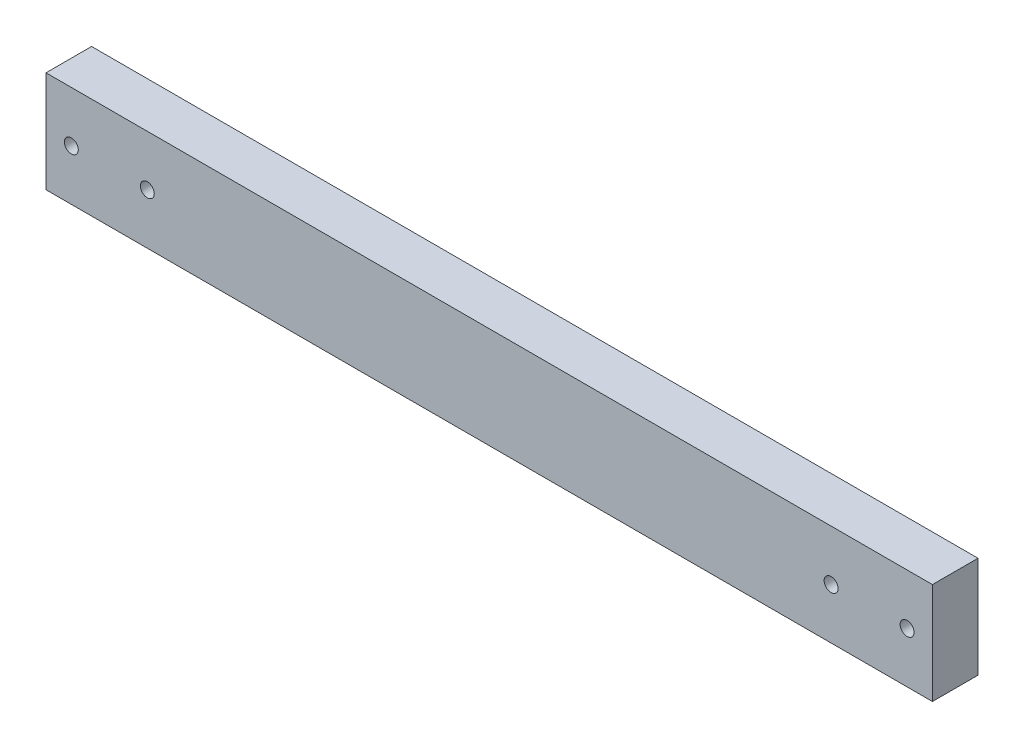
ISO-10303-21;
HEADER;
FILE_DESCRIPTION(('STEP AP214'),'2;1');
FILE_NAME('part.step','',(''),(''),'','','');
FILE_SCHEMA(('AUTOMOTIVE_DESIGN { 1 0 10303 214 1 1 1 1 }'));
ENDSEC;
DATA;
#1=APPLICATION_CONTEXT('core data for automotive mechanical design processes');
#2=APPLICATION_PROTOCOL_DEFINITION('international standard','automotive_design',2000,#1);
#3=PRODUCT_CONTEXT('',#1,'mechanical');
#4=PRODUCT('Part','Part','',(#3));
#5=PRODUCT_RELATED_PRODUCT_CATEGORY('part','',(#4));
#6=PRODUCT_DEFINITION_FORMATION('','',#4);
#7=PRODUCT_DEFINITION_CONTEXT('part definition',#1,'design');
#8=PRODUCT_DEFINITION('design','',#6,#7);
#9=PRODUCT_DEFINITION_SHAPE('','',#8);
#10=(LENGTH_UNIT() NAMED_UNIT(*) SI_UNIT(.MILLI.,.METRE.));
#11=(NAMED_UNIT(*) PLANE_ANGLE_UNIT() SI_UNIT($,.RADIAN.));
#12=(NAMED_UNIT(*) SI_UNIT($,.STERADIAN.) SOLID_ANGLE_UNIT());
#13=UNCERTAINTY_MEASURE_WITH_UNIT(LENGTH_MEASURE(1.E-05),#10,'distance_accuracy_value','');
#14=(GEOMETRIC_REPRESENTATION_CONTEXT(3) GLOBAL_UNCERTAINTY_ASSIGNED_CONTEXT((#13)) GLOBAL_UNIT_ASSIGNED_CONTEXT((#10,
#11,#12)) REPRESENTATION_CONTEXT('',''));
#15=CARTESIAN_POINT('',(0.,0.,0.));
#16=DIRECTION('',(0.,0.,1.));
#17=DIRECTION('',(1.,0.,0.));
#18=AXIS2_PLACEMENT_3D('',#15,#16,#17);
#19=CARTESIAN_POINT('',(0.,0.,18.));
#20=DIRECTION('',(1.,0.,0.));
#21=DIRECTION('',(0.,0.,-1.));
#22=AXIS2_PLACEMENT_3D('',#19,#20,#21);
#23=PLANE('',#22);
#24=DIRECTION('',(0.,-1.,0.));
#25=VECTOR('',#24,1.);
#26=CARTESIAN_POINT('',(0.,0.,0.));
#27=LINE('',#26,#25);
#28=CARTESIAN_POINT('',(0.,40.,0.));
#29=VERTEX_POINT('',#28);
#30=CARTESIAN_POINT('',(0.,0.,0.));
#31=VERTEX_POINT('',#30);
#32=EDGE_CURVE('E99',#29,#31,#27,.T.);
#33=ORIENTED_EDGE('',*,*,#32,.T.);
#34=DIRECTION('',(0.,0.,-1.));
#35=VECTOR('',#34,1.);
#36=CARTESIAN_POINT('',(0.,0.,18.));
#37=LINE('',#36,#35);
#38=CARTESIAN_POINT('',(0.,0.,18.));
#39=VERTEX_POINT('',#38);
#40=EDGE_CURVE('E11',#39,#31,#37,.T.);
#41=ORIENTED_EDGE('',*,*,#40,.F.);
#42=DIRECTION('',(0.,-1.,0.));
#43=VECTOR('',#42,1.);
#44=CARTESIAN_POINT('',(0.,0.,18.));
#45=LINE('',#44,#43);
#46=CARTESIAN_POINT('',(0.,40.,18.));
#47=VERTEX_POINT('',#46);
#48=EDGE_CURVE('E86',#47,#39,#45,.T.);
#49=ORIENTED_EDGE('',*,*,#48,.F.);
#50=DIRECTION('',(0.,0.,-1.));
#51=VECTOR('',#50,1.);
#52=CARTESIAN_POINT('',(0.,40.,18.));
#53=LINE('',#52,#51);
#54=EDGE_CURVE('E95',#47,#29,#53,.T.);
#55=ORIENTED_EDGE('',*,*,#54,.T.);
#56=EDGE_LOOP('',(#33,#41,#49,#55));
#57=FACE_BOUND('',#56,.T.);
#58=ADVANCED_FACE('F33',(#57),#23,.F.);
#59=CARTESIAN_POINT('',(0.,0.,18.));
#60=DIRECTION('',(0.,1.,0.));
#61=DIRECTION('',(0.,0.,1.));
#62=AXIS2_PLACEMENT_3D('',#59,#60,#61);
#63=PLANE('',#62);
#64=DIRECTION('',(1.,0.,0.));
#65=VECTOR('',#64,1.);
#66=CARTESIAN_POINT('',(0.,0.,0.));
#67=LINE('',#66,#65);
#68=CARTESIAN_POINT('',(350.,0.,0.));
#69=VERTEX_POINT('',#68);
#70=EDGE_CURVE('E90',#31,#69,#67,.T.);
#71=ORIENTED_EDGE('',*,*,#70,.T.);
#72=DIRECTION('',(0.,0.,-1.));
#73=VECTOR('',#72,1.);
#74=CARTESIAN_POINT('',(350.,0.,18.));
#75=LINE('',#74,#73);
#76=CARTESIAN_POINT('',(350.,0.,18.));
#77=VERTEX_POINT('',#76);
#78=EDGE_CURVE('E42',#77,#69,#75,.T.);
#79=ORIENTED_EDGE('',*,*,#78,.F.);
#80=DIRECTION('',(1.,0.,0.));
#81=VECTOR('',#80,1.);
#82=CARTESIAN_POINT('',(0.,0.,18.));
#83=LINE('',#82,#81);
#84=EDGE_CURVE('E81',#39,#77,#83,.T.);
#85=ORIENTED_EDGE('',*,*,#84,.F.);
#86=ORIENTED_EDGE('',*,*,#40,.T.);
#87=EDGE_LOOP('',(#71,#79,#85,#86));
#88=FACE_BOUND('',#87,.T.);
#89=ADVANCED_FACE('F89',(#88),#63,.F.);
#90=CARTESIAN_POINT('',(350.,0.,18.));
#91=DIRECTION('',(-1.,0.,0.));
#92=DIRECTION('',(0.,0.,1.));
#93=AXIS2_PLACEMENT_3D('',#90,#91,#92);
#94=PLANE('',#93);
#95=DIRECTION('',(0.,1.,0.));
#96=VECTOR('',#95,1.);
#97=CARTESIAN_POINT('',(350.,0.,0.));
#98=LINE('',#97,#96);
#99=CARTESIAN_POINT('',(350.,40.,0.));
#100=VERTEX_POINT('',#99);
#101=EDGE_CURVE('E68',#69,#100,#98,.T.);
#102=ORIENTED_EDGE('',*,*,#101,.T.);
#103=DIRECTION('',(0.,0.,-1.));
#104=VECTOR('',#103,1.);
#105=CARTESIAN_POINT('',(350.,40.,18.));
#106=LINE('',#105,#104);
#107=CARTESIAN_POINT('',(350.,40.,18.));
#108=VERTEX_POINT('',#107);
#109=EDGE_CURVE('E91',#108,#100,#106,.T.);
#110=ORIENTED_EDGE('',*,*,#109,.F.);
#111=DIRECTION('',(0.,1.,0.));
#112=VECTOR('',#111,1.);
#113=CARTESIAN_POINT('',(350.,0.,18.));
#114=LINE('',#113,#112);
#115=EDGE_CURVE('E84',#77,#108,#114,.T.);
#116=ORIENTED_EDGE('',*,*,#115,.F.);
#117=ORIENTED_EDGE('',*,*,#78,.T.);
#118=EDGE_LOOP('',(#102,#110,#116,#117));
#119=FACE_BOUND('',#118,.T.);
#120=ADVANCED_FACE('F93',(#119),#94,.F.);
#121=CARTESIAN_POINT('',(0.,40.,18.));
#122=DIRECTION('',(0.,-1.,0.));
#123=DIRECTION('',(0.,0.,-1.));
#124=AXIS2_PLACEMENT_3D('',#121,#122,#123);
#125=PLANE('',#124);
#126=DIRECTION('',(-1.,0.,0.));
#127=VECTOR('',#126,1.);
#128=CARTESIAN_POINT('',(0.,40.,0.));
#129=LINE('',#128,#127);
#130=EDGE_CURVE('E74',#100,#29,#129,.T.);
#131=ORIENTED_EDGE('',*,*,#130,.T.);
#132=ORIENTED_EDGE('',*,*,#54,.F.);
#133=DIRECTION('',(-1.,0.,0.));
#134=VECTOR('',#133,1.);
#135=CARTESIAN_POINT('',(0.,40.,18.));
#136=LINE('',#135,#134);
#137=EDGE_CURVE('E51',#108,#47,#136,.T.);
#138=ORIENTED_EDGE('',*,*,#137,.F.);
#139=ORIENTED_EDGE('',*,*,#109,.T.);
#140=EDGE_LOOP('',(#131,#132,#138,#139));
#141=FACE_BOUND('',#140,.T.);
#142=ADVANCED_FACE('F140',(#141),#125,.F.);
#143=CARTESIAN_POINT('',(0.,0.,18.));
#144=DIRECTION('',(0.,0.,-1.));
#145=DIRECTION('',(-1.,0.,0.));
#146=AXIS2_PLACEMENT_3D('',#143,#144,#145);
#147=PLANE('',#146);
#148=CARTESIAN_POINT('',(40.,20.,18.));
#149=DIRECTION('',(0.,0.,1.));
#150=DIRECTION('',(1.,0.,0.));
#151=AXIS2_PLACEMENT_3D('',#148,#149,#150);
#152=CIRCLE('',#151,2.75);
#153=CARTESIAN_POINT('',(42.75,20.,18.));
#154=VERTEX_POINT('',#153);
#155=EDGE_CURVE('E114',#154,#154,#152,.T.);
#156=ORIENTED_EDGE('',*,*,#155,.F.);
#157=EDGE_LOOP('',(#156));
#158=FACE_BOUND('',#157,.T.);
#159=CARTESIAN_POINT('',(310.,20.,18.));
#160=DIRECTION('',(0.,0.,1.));
#161=DIRECTION('',(1.,0.,0.));
#162=AXIS2_PLACEMENT_3D('',#159,#160,#161);
#163=CIRCLE('',#162,2.74999999999998);
#164=CARTESIAN_POINT('',(312.75,20.,18.));
#165=VERTEX_POINT('',#164);
#166=EDGE_CURVE('E129',#165,#165,#163,.T.);
#167=ORIENTED_EDGE('',*,*,#166,.F.);
#168=EDGE_LOOP('',(#167));
#169=FACE_BOUND('',#168,.T.);
#170=CARTESIAN_POINT('',(340.,20.,18.));
#171=DIRECTION('',(0.,0.,1.));
#172=DIRECTION('',(1.,0.,0.));
#173=AXIS2_PLACEMENT_3D('',#170,#171,#172);
#174=CIRCLE('',#173,2.74999999999998);
#175=CARTESIAN_POINT('',(342.75,20.,18.));
#176=VERTEX_POINT('',#175);
#177=EDGE_CURVE('E126',#176,#176,#174,.T.);
#178=ORIENTED_EDGE('',*,*,#177,.F.);
#179=EDGE_LOOP('',(#178));
#180=FACE_BOUND('',#179,.T.);
#181=CARTESIAN_POINT('',(10.,20.,18.));
#182=DIRECTION('',(0.,0.,1.));
#183=DIRECTION('',(1.,0.,0.));
#184=AXIS2_PLACEMENT_3D('',#181,#182,#183);
#185=CIRCLE('',#184,2.75);
#186=CARTESIAN_POINT('',(12.75,20.,18.));
#187=VERTEX_POINT('',#186);
#188=EDGE_CURVE('E110',#187,#187,#185,.T.);
#189=ORIENTED_EDGE('',*,*,#188,.F.);
#190=EDGE_LOOP('',(#189));
#191=FACE_BOUND('',#190,.T.);
#192=ORIENTED_EDGE('',*,*,#48,.T.);
#193=ORIENTED_EDGE('',*,*,#84,.T.);
#194=ORIENTED_EDGE('',*,*,#115,.T.);
#195=ORIENTED_EDGE('',*,*,#137,.T.);
#196=EDGE_LOOP('',(#192,#193,#194,#195));
#197=FACE_BOUND('',#196,.T.);
#198=ADVANCED_FACE('F82',(#158,#169,#180,#191,#197),#147,.F.);
#199=CARTESIAN_POINT('',(0.,0.,0.));
#200=DIRECTION('',(0.,0.,-1.));
#201=DIRECTION('',(-1.,0.,0.));
#202=AXIS2_PLACEMENT_3D('',#199,#200,#201);
#203=PLANE('',#202);
#204=CARTESIAN_POINT('',(40.,20.,0.));
#205=DIRECTION('',(0.,0.,-1.));
#206=DIRECTION('',(-1.,0.,0.));
#207=AXIS2_PLACEMENT_3D('',#204,#205,#206);
#208=CIRCLE('',#207,2.75);
#209=CARTESIAN_POINT('',(37.25,20.,0.));
#210=VERTEX_POINT('',#209);
#211=EDGE_CURVE('E36',#210,#210,#208,.T.);
#212=ORIENTED_EDGE('',*,*,#211,.F.);
#213=EDGE_LOOP('',(#212));
#214=FACE_BOUND('',#213,.T.);
#215=CARTESIAN_POINT('',(310.,20.,0.));
#216=DIRECTION('',(0.,0.,-1.));
#217=DIRECTION('',(-1.,0.,0.));
#218=AXIS2_PLACEMENT_3D('',#215,#216,#217);
#219=CIRCLE('',#218,2.74999999999998);
#220=CARTESIAN_POINT('',(307.25,20.,0.));
#221=VERTEX_POINT('',#220);
#222=EDGE_CURVE('E113',#221,#221,#219,.T.);
#223=ORIENTED_EDGE('',*,*,#222,.F.);
#224=EDGE_LOOP('',(#223));
#225=FACE_BOUND('',#224,.T.);
#226=CARTESIAN_POINT('',(340.,20.,0.));
#227=DIRECTION('',(0.,0.,-1.));
#228=DIRECTION('',(-1.,0.,0.));
#229=AXIS2_PLACEMENT_3D('',#226,#227,#228);
#230=CIRCLE('',#229,2.74999999999998);
#231=CARTESIAN_POINT('',(337.25,20.,0.));
#232=VERTEX_POINT('',#231);
#233=EDGE_CURVE('E111',#232,#232,#230,.T.);
#234=ORIENTED_EDGE('',*,*,#233,.F.);
#235=EDGE_LOOP('',(#234));
#236=FACE_BOUND('',#235,.T.);
#237=CARTESIAN_POINT('',(10.,20.,0.));
#238=DIRECTION('',(0.,0.,-1.));
#239=DIRECTION('',(-1.,0.,0.));
#240=AXIS2_PLACEMENT_3D('',#237,#238,#239);
#241=CIRCLE('',#240,2.75);
#242=CARTESIAN_POINT('',(7.25,20.,0.));
#243=VERTEX_POINT('',#242);
#244=EDGE_CURVE('E102',#243,#243,#241,.T.);
#245=ORIENTED_EDGE('',*,*,#244,.F.);
#246=EDGE_LOOP('',(#245));
#247=FACE_BOUND('',#246,.T.);
#248=ORIENTED_EDGE('',*,*,#32,.F.);
#249=ORIENTED_EDGE('',*,*,#130,.F.);
#250=ORIENTED_EDGE('',*,*,#101,.F.);
#251=ORIENTED_EDGE('',*,*,#70,.F.);
#252=EDGE_LOOP('',(#248,#249,#250,#251));
#253=FACE_BOUND('',#252,.T.);
#254=ADVANCED_FACE('F139',(#214,#225,#236,#247,#253),#203,.T.);
#255=CARTESIAN_POINT('',(10.,20.,-2.));
#256=DIRECTION('',(0.,0.,1.));
#257=DIRECTION('',(1.,0.,0.));
#258=AXIS2_PLACEMENT_3D('',#255,#256,#257);
#259=CYLINDRICAL_SURFACE('',#258,2.75);
#260=ORIENTED_EDGE('',*,*,#244,.T.);
#261=EDGE_LOOP('',(#260));
#262=FACE_BOUND('',#261,.T.);
#263=ORIENTED_EDGE('',*,*,#188,.T.);
#264=EDGE_LOOP('',(#263));
#265=FACE_BOUND('',#264,.T.);
#266=ADVANCED_FACE('F150',(#262,#265),#259,.F.);
#267=CARTESIAN_POINT('',(340.,20.,-2.));
#268=DIRECTION('',(0.,0.,1.));
#269=DIRECTION('',(1.,0.,0.));
#270=AXIS2_PLACEMENT_3D('',#267,#268,#269);
#271=CYLINDRICAL_SURFACE('',#270,2.74999999999998);
#272=ORIENTED_EDGE('',*,*,#233,.T.);
#273=EDGE_LOOP('',(#272));
#274=FACE_BOUND('',#273,.T.);
#275=ORIENTED_EDGE('',*,*,#177,.T.);
#276=EDGE_LOOP('',(#275));
#277=FACE_BOUND('',#276,.T.);
#278=ADVANCED_FACE('F147',(#274,#277),#271,.F.);
#279=CARTESIAN_POINT('',(310.,20.,-2.));
#280=DIRECTION('',(0.,0.,1.));
#281=DIRECTION('',(1.,0.,0.));
#282=AXIS2_PLACEMENT_3D('',#279,#280,#281);
#283=CYLINDRICAL_SURFACE('',#282,2.74999999999998);
#284=ORIENTED_EDGE('',*,*,#222,.T.);
#285=EDGE_LOOP('',(#284));
#286=FACE_BOUND('',#285,.T.);
#287=ORIENTED_EDGE('',*,*,#166,.T.);
#288=EDGE_LOOP('',(#287));
#289=FACE_BOUND('',#288,.T.);
#290=ADVANCED_FACE('F149',(#286,#289),#283,.F.);
#291=CARTESIAN_POINT('',(40.,20.,-2.));
#292=DIRECTION('',(0.,0.,1.));
#293=DIRECTION('',(1.,0.,0.));
#294=AXIS2_PLACEMENT_3D('',#291,#292,#293);
#295=CYLINDRICAL_SURFACE('',#294,2.75);
#296=ORIENTED_EDGE('',*,*,#211,.T.);
#297=EDGE_LOOP('',(#296));
#298=FACE_BOUND('',#297,.T.);
#299=ORIENTED_EDGE('',*,*,#155,.T.);
#300=EDGE_LOOP('',(#299));
#301=FACE_BOUND('',#300,.T.);
#302=ADVANCED_FACE('F135',(#298,#301),#295,.F.);
#303=CLOSED_SHELL('',(#58,#89,#120,#142,#198,#254,#266,#278,#290,#302));
#304=MANIFOLD_SOLID_BREP('B2',#303);
#305=ADVANCED_BREP_SHAPE_REPRESENTATION('',(#18,#304),#14);
#306=SHAPE_DEFINITION_REPRESENTATION(#9,#305);
ENDSEC;
END-ISO-10303-21;
